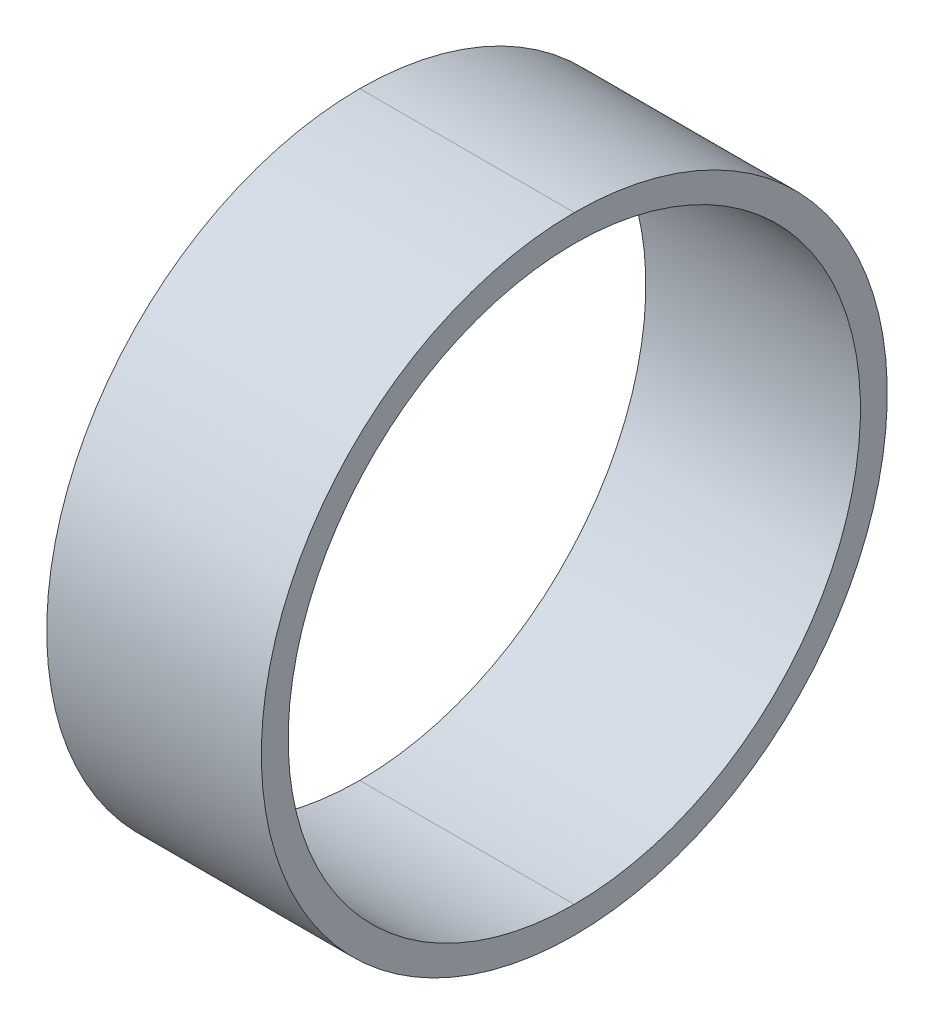
ISO-10303-21;
HEADER;
FILE_DESCRIPTION(('STEP AP214'),'2;1');
FILE_NAME('part.step','',(''),(''),'','','');
FILE_SCHEMA(('AUTOMOTIVE_DESIGN { 1 0 10303 214 1 1 1 1 }'));
ENDSEC;
DATA;
#1=APPLICATION_CONTEXT('core data for automotive mechanical design processes');
#2=APPLICATION_PROTOCOL_DEFINITION('international standard','automotive_design',2000,#1);
#3=PRODUCT_CONTEXT('',#1,'mechanical');
#4=PRODUCT('Part','Part','',(#3));
#5=PRODUCT_RELATED_PRODUCT_CATEGORY('part','',(#4));
#6=PRODUCT_DEFINITION_FORMATION('','',#4);
#7=PRODUCT_DEFINITION_CONTEXT('part definition',#1,'design');
#8=PRODUCT_DEFINITION('design','',#6,#7);
#9=PRODUCT_DEFINITION_SHAPE('','',#8);
#10=(LENGTH_UNIT() NAMED_UNIT(*) SI_UNIT(.MILLI.,.METRE.));
#11=(NAMED_UNIT(*) PLANE_ANGLE_UNIT() SI_UNIT($,.RADIAN.));
#12=(NAMED_UNIT(*) SI_UNIT($,.STERADIAN.) SOLID_ANGLE_UNIT());
#13=UNCERTAINTY_MEASURE_WITH_UNIT(LENGTH_MEASURE(1.E-05),#10,'distance_accuracy_value','');
#14=(GEOMETRIC_REPRESENTATION_CONTEXT(3) GLOBAL_UNCERTAINTY_ASSIGNED_CONTEXT((#13)) GLOBAL_UNIT_ASSIGNED_CONTEXT((#10,
#11,#12)) REPRESENTATION_CONTEXT('',''));
#15=CARTESIAN_POINT('',(0.,0.,0.));
#16=DIRECTION('',(0.,0.,1.));
#17=DIRECTION('',(1.,0.,0.));
#18=AXIS2_PLACEMENT_3D('',#15,#16,#17);
#19=CARTESIAN_POINT('',(-12.,0.,0.));
#20=DIRECTION('',(1.,0.,0.));
#21=DIRECTION('',(0.,-1.,0.));
#22=AXIS2_PLACEMENT_3D('',#19,#20,#21);
#23=PLANE('',#22);
#24=CARTESIAN_POINT('',(-12.,0.,0.));
#25=DIRECTION('',(-1.,0.,0.));
#26=DIRECTION('',(0.,1.,0.));
#27=AXIS2_PLACEMENT_3D('',#24,#25,#26);
#28=CIRCLE('',#27,32.);
#29=CARTESIAN_POINT('',(-12.,32.,0.));
#30=VERTEX_POINT('',#29);
#31=CARTESIAN_POINT('',(-12.,-32.,0.));
#32=VERTEX_POINT('',#31);
#33=EDGE_CURVE('E26',#30,#32,#28,.T.);
#34=ORIENTED_EDGE('',*,*,#33,.F.);
#35=CARTESIAN_POINT('',(-12.,0.,0.));
#36=DIRECTION('',(-1.,0.,0.));
#37=DIRECTION('',(0.,-1.,0.));
#38=AXIS2_PLACEMENT_3D('',#35,#36,#37);
#39=CIRCLE('',#38,32.);
#40=EDGE_CURVE('E35',#32,#30,#39,.T.);
#41=ORIENTED_EDGE('',*,*,#40,.F.);
#42=EDGE_LOOP('',(#34,#41));
#43=FACE_BOUND('',#42,.T.);
#44=CARTESIAN_POINT('',(-12.,0.,0.));
#45=DIRECTION('',(1.,0.,0.));
#46=DIRECTION('',(0.,1.,0.));
#47=AXIS2_PLACEMENT_3D('',#44,#45,#46);
#48=CIRCLE('',#47,35.);
#49=CARTESIAN_POINT('',(-12.,35.,0.));
#50=VERTEX_POINT('',#49);
#51=CARTESIAN_POINT('',(-12.,-35.,0.));
#52=VERTEX_POINT('',#51);
#53=EDGE_CURVE('E19',#50,#52,#48,.T.);
#54=ORIENTED_EDGE('',*,*,#53,.F.);
#55=CARTESIAN_POINT('',(-12.,0.,0.));
#56=DIRECTION('',(1.,0.,0.));
#57=DIRECTION('',(0.,-1.,0.));
#58=AXIS2_PLACEMENT_3D('',#55,#56,#57);
#59=CIRCLE('',#58,35.);
#60=EDGE_CURVE('E47',#52,#50,#59,.T.);
#61=ORIENTED_EDGE('',*,*,#60,.F.);
#62=EDGE_LOOP('',(#54,#61));
#63=FACE_BOUND('',#62,.T.);
#64=ADVANCED_FACE('F15',(#43,#63),#23,.F.);
#65=CARTESIAN_POINT('',(-12.,0.,0.));
#66=DIRECTION('',(-1.,0.,0.));
#67=DIRECTION('',(0.,-1.,0.));
#68=AXIS2_PLACEMENT_3D('',#65,#66,#67);
#69=CYLINDRICAL_SURFACE('',#68,32.);
#70=DIRECTION('',(1.,0.,0.));
#71=VECTOR('',#70,1.);
#72=CARTESIAN_POINT('',(-12.,-32.,0.));
#73=LINE('',#72,#71);
#74=CARTESIAN_POINT('',(12.,-32.,0.));
#75=VERTEX_POINT('',#74);
#76=EDGE_CURVE('E9',#32,#75,#73,.T.);
#77=ORIENTED_EDGE('',*,*,#76,.T.);
#78=CARTESIAN_POINT('',(12.,0.,0.));
#79=DIRECTION('',(-1.,0.,0.));
#80=DIRECTION('',(0.,1.,0.));
#81=AXIS2_PLACEMENT_3D('',#78,#79,#80);
#82=CIRCLE('',#81,32.);
#83=CARTESIAN_POINT('',(12.,32.,0.));
#84=VERTEX_POINT('',#83);
#85=EDGE_CURVE('E54',#84,#75,#82,.T.);
#86=ORIENTED_EDGE('',*,*,#85,.F.);
#87=DIRECTION('',(1.,0.,0.));
#88=VECTOR('',#87,1.);
#89=CARTESIAN_POINT('',(-12.,32.,0.));
#90=LINE('',#89,#88);
#91=EDGE_CURVE('E96',#30,#84,#90,.T.);
#92=ORIENTED_EDGE('',*,*,#91,.F.);
#93=ORIENTED_EDGE('',*,*,#33,.T.);
#94=EDGE_LOOP('',(#77,#86,#92,#93));
#95=FACE_BOUND('',#94,.T.);
#96=ADVANCED_FACE('F136',(#95),#69,.F.);
#97=CARTESIAN_POINT('',(-12.,0.,0.));
#98=DIRECTION('',(-1.,0.,0.));
#99=DIRECTION('',(0.,-1.,0.));
#100=AXIS2_PLACEMENT_3D('',#97,#98,#99);
#101=CYLINDRICAL_SURFACE('',#100,32.);
#102=ORIENTED_EDGE('',*,*,#91,.T.);
#103=CARTESIAN_POINT('',(12.,0.,0.));
#104=DIRECTION('',(-1.,0.,0.));
#105=DIRECTION('',(0.,-1.,0.));
#106=AXIS2_PLACEMENT_3D('',#103,#104,#105);
#107=CIRCLE('',#106,32.);
#108=EDGE_CURVE('E74',#75,#84,#107,.T.);
#109=ORIENTED_EDGE('',*,*,#108,.F.);
#110=ORIENTED_EDGE('',*,*,#76,.F.);
#111=ORIENTED_EDGE('',*,*,#40,.T.);
#112=EDGE_LOOP('',(#102,#109,#110,#111));
#113=FACE_BOUND('',#112,.T.);
#114=ADVANCED_FACE('F131',(#113),#101,.F.);
#115=CARTESIAN_POINT('',(-12.,0.,0.));
#116=DIRECTION('',(-1.,0.,0.));
#117=DIRECTION('',(0.,-1.,0.));
#118=AXIS2_PLACEMENT_3D('',#115,#116,#117);
#119=CYLINDRICAL_SURFACE('',#118,35.);
#120=DIRECTION('',(1.,0.,0.));
#121=VECTOR('',#120,1.);
#122=CARTESIAN_POINT('',(-12.,-35.,0.));
#123=LINE('',#122,#121);
#124=CARTESIAN_POINT('',(12.,-35.,0.));
#125=VERTEX_POINT('',#124);
#126=EDGE_CURVE('E71',#52,#125,#123,.T.);
#127=ORIENTED_EDGE('',*,*,#126,.T.);
#128=CARTESIAN_POINT('',(12.,0.,0.));
#129=DIRECTION('',(1.,0.,0.));
#130=DIRECTION('',(0.,1.,0.));
#131=AXIS2_PLACEMENT_3D('',#128,#129,#130);
#132=CIRCLE('',#131,35.);
#133=CARTESIAN_POINT('',(12.,35.,0.));
#134=VERTEX_POINT('',#133);
#135=EDGE_CURVE('E64',#134,#125,#132,.T.);
#136=ORIENTED_EDGE('',*,*,#135,.F.);
#137=DIRECTION('',(1.,0.,0.));
#138=VECTOR('',#137,1.);
#139=CARTESIAN_POINT('',(-12.,35.,0.));
#140=LINE('',#139,#138);
#141=EDGE_CURVE('E69',#50,#134,#140,.T.);
#142=ORIENTED_EDGE('',*,*,#141,.F.);
#143=ORIENTED_EDGE('',*,*,#53,.T.);
#144=EDGE_LOOP('',(#127,#136,#142,#143));
#145=FACE_BOUND('',#144,.T.);
#146=ADVANCED_FACE('F17',(#145),#119,.T.);
#147=CARTESIAN_POINT('',(-12.,0.,0.));
#148=DIRECTION('',(-1.,0.,0.));
#149=DIRECTION('',(0.,-1.,0.));
#150=AXIS2_PLACEMENT_3D('',#147,#148,#149);
#151=CYLINDRICAL_SURFACE('',#150,35.);
#152=ORIENTED_EDGE('',*,*,#141,.T.);
#153=CARTESIAN_POINT('',(12.,0.,0.));
#154=DIRECTION('',(1.,0.,0.));
#155=DIRECTION('',(0.,-1.,0.));
#156=AXIS2_PLACEMENT_3D('',#153,#154,#155);
#157=CIRCLE('',#156,35.);
#158=EDGE_CURVE('E75',#125,#134,#157,.T.);
#159=ORIENTED_EDGE('',*,*,#158,.F.);
#160=ORIENTED_EDGE('',*,*,#126,.F.);
#161=ORIENTED_EDGE('',*,*,#60,.T.);
#162=EDGE_LOOP('',(#152,#159,#160,#161));
#163=FACE_BOUND('',#162,.T.);
#164=ADVANCED_FACE('F77',(#163),#151,.T.);
#165=CARTESIAN_POINT('',(12.,0.,0.));
#166=DIRECTION('',(1.,0.,0.));
#167=DIRECTION('',(0.,-1.,0.));
#168=AXIS2_PLACEMENT_3D('',#165,#166,#167);
#169=PLANE('',#168);
#170=ORIENTED_EDGE('',*,*,#85,.T.);
#171=ORIENTED_EDGE('',*,*,#108,.T.);
#172=EDGE_LOOP('',(#170,#171));
#173=FACE_BOUND('',#172,.T.);
#174=ORIENTED_EDGE('',*,*,#135,.T.);
#175=ORIENTED_EDGE('',*,*,#158,.T.);
#176=EDGE_LOOP('',(#174,#175));
#177=FACE_BOUND('',#176,.T.);
#178=ADVANCED_FACE('F80',(#173,#177),#169,.T.);
#179=CLOSED_SHELL('',(#64,#96,#114,#146,#164,#178));
#180=MANIFOLD_SOLID_BREP('B1',#179);
#181=ADVANCED_BREP_SHAPE_REPRESENTATION('',(#18,#180),#14);
#182=SHAPE_DEFINITION_REPRESENTATION(#9,#181);
ENDSEC;
END-ISO-10303-21;
